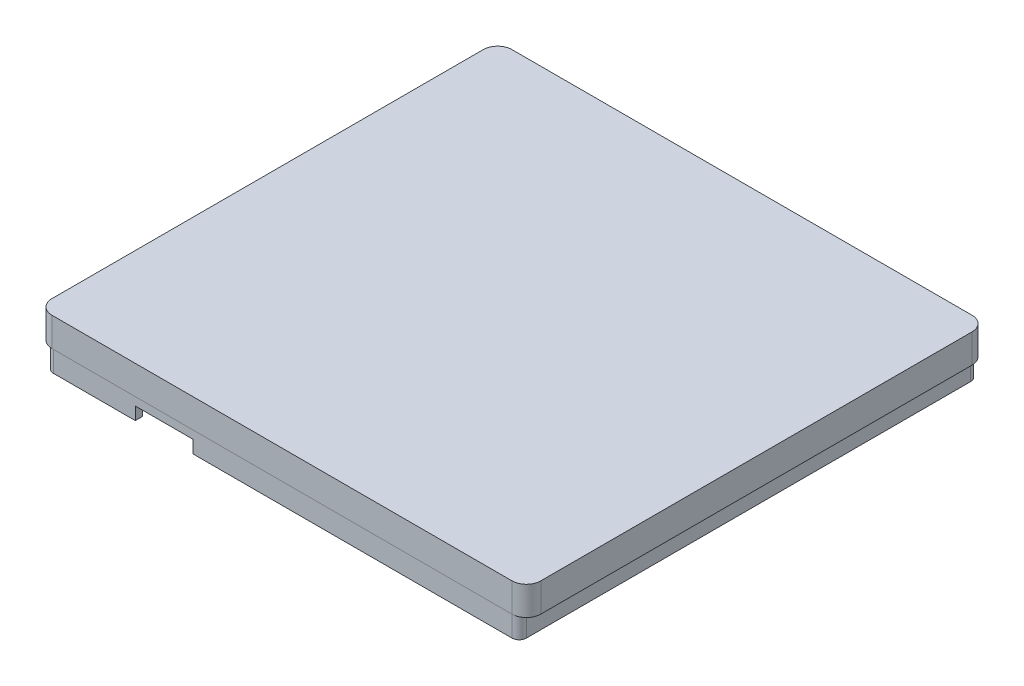
ISO-10303-21;
HEADER;
FILE_DESCRIPTION(('STEP AP214'),'2;1');
FILE_NAME('part.step','',(''),(''),'','','');
FILE_SCHEMA(('AUTOMOTIVE_DESIGN { 1 0 10303 214 1 1 1 1 }'));
ENDSEC;
DATA;
#1=APPLICATION_CONTEXT('core data for automotive mechanical design processes');
#2=APPLICATION_PROTOCOL_DEFINITION('international standard','automotive_design',2000,#1);
#3=PRODUCT_CONTEXT('',#1,'mechanical');
#4=PRODUCT('Part','Part','',(#3));
#5=PRODUCT_RELATED_PRODUCT_CATEGORY('part','',(#4));
#6=PRODUCT_DEFINITION_FORMATION('','',#4);
#7=PRODUCT_DEFINITION_CONTEXT('part definition',#1,'design');
#8=PRODUCT_DEFINITION('design','',#6,#7);
#9=PRODUCT_DEFINITION_SHAPE('','',#8);
#10=(LENGTH_UNIT() NAMED_UNIT(*) SI_UNIT(.MILLI.,.METRE.));
#11=(NAMED_UNIT(*) PLANE_ANGLE_UNIT() SI_UNIT($,.RADIAN.));
#12=(NAMED_UNIT(*) SI_UNIT($,.STERADIAN.) SOLID_ANGLE_UNIT());
#13=UNCERTAINTY_MEASURE_WITH_UNIT(LENGTH_MEASURE(1.E-05),#10,'distance_accuracy_value','');
#14=(GEOMETRIC_REPRESENTATION_CONTEXT(3) GLOBAL_UNCERTAINTY_ASSIGNED_CONTEXT((#13)) GLOBAL_UNIT_ASSIGNED_CONTEXT((#10,
#11,#12)) REPRESENTATION_CONTEXT('',''));
#15=CARTESIAN_POINT('',(0.,0.,0.));
#16=DIRECTION('',(0.,0.,1.));
#17=DIRECTION('',(1.,0.,0.));
#18=AXIS2_PLACEMENT_3D('',#15,#16,#17);
#19=CARTESIAN_POINT('',(-32.,39.0661862772259,30.));
#20=DIRECTION('',(0.,1.,0.));
#21=DIRECTION('',(0.,0.,1.));
#22=AXIS2_PLACEMENT_3D('',#19,#20,#21);
#23=CYLINDRICAL_SURFACE('',#22,2.);
#24=CARTESIAN_POINT('',(-32.,39.0661862772259,30.));
#25=DIRECTION('',(0.,1.,0.));
#26=DIRECTION('',(0.,0.,1.));
#27=AXIS2_PLACEMENT_3D('',#24,#25,#26);
#28=CIRCLE('',#27,2.);
#29=CARTESIAN_POINT('',(-34.,39.0661862772259,30.));
#30=VERTEX_POINT('',#29);
#31=CARTESIAN_POINT('',(-32.,39.0661862772259,32.));
#32=VERTEX_POINT('',#31);
#33=EDGE_CURVE('E443',#30,#32,#28,.T.);
#34=ORIENTED_EDGE('',*,*,#33,.T.);
#35=DIRECTION('',(0.,1.,0.));
#36=VECTOR('',#35,1.);
#37=CARTESIAN_POINT('',(-32.,39.0661862772259,32.));
#38=LINE('',#37,#36);
#39=CARTESIAN_POINT('',(-32.,43.0761862772259,32.));
#40=VERTEX_POINT('',#39);
#41=EDGE_CURVE('E472',#32,#40,#38,.T.);
#42=ORIENTED_EDGE('',*,*,#41,.T.);
#43=CARTESIAN_POINT('',(-32.,43.0761862772259,30.));
#44=DIRECTION('',(0.,1.,0.));
#45=DIRECTION('',(0.,0.,1.));
#46=AXIS2_PLACEMENT_3D('',#43,#44,#45);
#47=CIRCLE('',#46,2.);
#48=CARTESIAN_POINT('',(-32.9,43.0761862772259,31.7860571099492));
#49=VERTEX_POINT('',#48);
#50=EDGE_CURVE('E417',#49,#40,#47,.T.);
#51=ORIENTED_EDGE('',*,*,#50,.F.);
#52=CARTESIAN_POINT('',(-34.,43.0761862772259,30.));
#53=VERTEX_POINT('',#52);
#54=EDGE_CURVE('E418',#53,#49,#47,.T.);
#55=ORIENTED_EDGE('',*,*,#54,.F.);
#56=DIRECTION('',(0.,1.,0.));
#57=VECTOR('',#56,1.);
#58=CARTESIAN_POINT('',(-34.,39.0661862772259,30.));
#59=LINE('',#58,#57);
#60=EDGE_CURVE('E475',#30,#53,#59,.T.);
#61=ORIENTED_EDGE('',*,*,#60,.F.);
#62=EDGE_LOOP('',(#34,#42,#51,#55,#61));
#63=FACE_BOUND('',#62,.T.);
#64=ADVANCED_FACE('F39',(#63),#23,.T.);
#65=CARTESIAN_POINT('',(-32.,39.0661862772259,-30.));
#66=DIRECTION('',(0.,1.,0.));
#67=DIRECTION('',(0.,0.,1.));
#68=AXIS2_PLACEMENT_3D('',#65,#66,#67);
#69=PLANE('',#68);
#70=DIRECTION('',(-1.,0.,0.));
#71=VECTOR('',#70,1.);
#72=CARTESIAN_POINT('',(32.,39.0661862772259,-32.));
#73=LINE('',#72,#71);
#74=CARTESIAN_POINT('',(32.,39.0661862772259,-32.));
#75=VERTEX_POINT('',#74);
#76=CARTESIAN_POINT('',(-32.,39.0661862772259,-32.));
#77=VERTEX_POINT('',#76);
#78=EDGE_CURVE('E455',#75,#77,#73,.T.);
#79=ORIENTED_EDGE('',*,*,#78,.F.);
#80=CARTESIAN_POINT('',(32.,39.0661862772259,-30.));
#81=DIRECTION('',(0.,1.,0.));
#82=DIRECTION('',(0.,0.,1.));
#83=AXIS2_PLACEMENT_3D('',#80,#81,#82);
#84=CIRCLE('',#83,2.);
#85=CARTESIAN_POINT('',(34.,39.0661862772259,-30.));
#86=VERTEX_POINT('',#85);
#87=EDGE_CURVE('E453',#86,#75,#84,.T.);
#88=ORIENTED_EDGE('',*,*,#87,.F.);
#89=DIRECTION('',(0.,0.,-1.));
#90=VECTOR('',#89,1.);
#91=CARTESIAN_POINT('',(34.,39.0661862772259,30.));
#92=LINE('',#91,#90);
#93=CARTESIAN_POINT('',(34.,39.0661862772259,30.));
#94=VERTEX_POINT('',#93);
#95=EDGE_CURVE('E450',#94,#86,#92,.T.);
#96=ORIENTED_EDGE('',*,*,#95,.F.);
#97=CARTESIAN_POINT('',(32.,39.0661862772259,30.));
#98=DIRECTION('',(0.,1.,0.));
#99=DIRECTION('',(0.,0.,1.));
#100=AXIS2_PLACEMENT_3D('',#97,#98,#99);
#101=CIRCLE('',#100,2.);
#102=CARTESIAN_POINT('',(32.,39.0661862772259,32.));
#103=VERTEX_POINT('',#102);
#104=EDGE_CURVE('E448',#103,#94,#101,.T.);
#105=ORIENTED_EDGE('',*,*,#104,.F.);
#106=DIRECTION('',(1.,0.,0.));
#107=VECTOR('',#106,1.);
#108=CARTESIAN_POINT('',(-32.,39.0661862772259,32.));
#109=LINE('',#108,#107);
#110=EDGE_CURVE('E445',#32,#103,#109,.T.);
#111=ORIENTED_EDGE('',*,*,#110,.F.);
#112=ORIENTED_EDGE('',*,*,#33,.F.);
#113=DIRECTION('',(0.,0.,1.));
#114=VECTOR('',#113,1.);
#115=CARTESIAN_POINT('',(-34.,39.0661862772259,-30.));
#116=LINE('',#115,#114);
#117=CARTESIAN_POINT('',(-34.,39.0661862772259,-30.));
#118=VERTEX_POINT('',#117);
#119=EDGE_CURVE('E440',#118,#30,#116,.T.);
#120=ORIENTED_EDGE('',*,*,#119,.F.);
#121=CARTESIAN_POINT('',(-32.,39.0661862772259,-30.));
#122=DIRECTION('',(0.,1.,0.));
#123=DIRECTION('',(0.,0.,1.));
#124=AXIS2_PLACEMENT_3D('',#121,#122,#123);
#125=CIRCLE('',#124,2.);
#126=EDGE_CURVE('E438',#77,#118,#125,.T.);
#127=ORIENTED_EDGE('',*,*,#126,.F.);
#128=EDGE_LOOP('',(#79,#88,#96,#105,#111,#112,#120,#127));
#129=FACE_BOUND('',#128,.T.);
#130=DIRECTION('',(0.,0.,-1.));
#131=VECTOR('',#130,1.);
#132=CARTESIAN_POINT('',(32.9,39.0661862772259,-30.));
#133=LINE('',#132,#131);
#134=CARTESIAN_POINT('',(32.9,39.0661862772259,-30.4358898943541));
#135=VERTEX_POINT('',#134);
#136=CARTESIAN_POINT('',(32.9,39.0661862772259,-30.9));
#137=VERTEX_POINT('',#136);
#138=EDGE_CURVE('E350',#135,#137,#133,.T.);
#139=ORIENTED_EDGE('',*,*,#138,.T.);
#140=CARTESIAN_POINT('',(31.9,39.0661862772259,-30.9));
#141=DIRECTION('',(0.,1.,0.));
#142=DIRECTION('',(0.,0.,1.));
#143=AXIS2_PLACEMENT_3D('',#140,#141,#142);
#144=CIRCLE('',#143,1.);
#145=CARTESIAN_POINT('',(31.9,39.0661862772259,-31.9));
#146=VERTEX_POINT('',#145);
#147=EDGE_CURVE('E77',#137,#146,#144,.T.);
#148=ORIENTED_EDGE('',*,*,#147,.T.);
#149=DIRECTION('',(-1.,0.,0.));
#150=VECTOR('',#149,1.);
#151=CARTESIAN_POINT('',(-32.,39.0661862772259,-31.9));
#152=LINE('',#151,#150);
#153=CARTESIAN_POINT('',(-31.9,39.0661862772259,-31.9));
#154=VERTEX_POINT('',#153);
#155=EDGE_CURVE('E365',#146,#154,#152,.T.);
#156=ORIENTED_EDGE('',*,*,#155,.T.);
#157=CARTESIAN_POINT('',(-31.9,39.0661862772259,-30.9));
#158=DIRECTION('',(0.,1.,0.));
#159=DIRECTION('',(0.,0.,1.));
#160=AXIS2_PLACEMENT_3D('',#157,#158,#159);
#161=CIRCLE('',#160,1.);
#162=CARTESIAN_POINT('',(-32.9,39.0661862772259,-30.9));
#163=VERTEX_POINT('',#162);
#164=EDGE_CURVE('E63',#154,#163,#161,.T.);
#165=ORIENTED_EDGE('',*,*,#164,.T.);
#166=DIRECTION('',(0.,0.,1.));
#167=VECTOR('',#166,1.);
#168=CARTESIAN_POINT('',(-32.9,39.0661862772259,-30.));
#169=LINE('',#168,#167);
#170=CARTESIAN_POINT('',(-32.9,39.0661862772259,-30.435889894354));
#171=VERTEX_POINT('',#170);
#172=EDGE_CURVE('E362',#163,#171,#169,.T.);
#173=ORIENTED_EDGE('',*,*,#172,.T.);
#174=CARTESIAN_POINT('',(-32.,39.0661862772259,-30.));
#175=DIRECTION('',(0.,1.,0.));
#176=DIRECTION('',(0.,0.,1.));
#177=AXIS2_PLACEMENT_3D('',#174,#175,#176);
#178=CIRCLE('',#177,1.);
#179=CARTESIAN_POINT('',(-33.,39.0661862772259,-30.));
#180=VERTEX_POINT('',#179);
#181=EDGE_CURVE('E379',#171,#180,#178,.T.);
#182=ORIENTED_EDGE('',*,*,#181,.T.);
#183=DIRECTION('',(0.,0.,1.));
#184=VECTOR('',#183,1.);
#185=CARTESIAN_POINT('',(-33.,39.0661862772259,-30.));
#186=LINE('',#185,#184);
#187=CARTESIAN_POINT('',(-33.,39.0661862772259,30.));
#188=VERTEX_POINT('',#187);
#189=EDGE_CURVE('E398',#180,#188,#186,.T.);
#190=ORIENTED_EDGE('',*,*,#189,.T.);
#191=CARTESIAN_POINT('',(-32.,39.0661862772259,30.));
#192=DIRECTION('',(0.,1.,0.));
#193=DIRECTION('',(0.,0.,1.));
#194=AXIS2_PLACEMENT_3D('',#191,#192,#193);
#195=CIRCLE('',#194,1.);
#196=CARTESIAN_POINT('',(-32.9,39.0661862772259,30.4358898943541));
#197=VERTEX_POINT('',#196);
#198=EDGE_CURVE('E406',#188,#197,#195,.T.);
#199=ORIENTED_EDGE('',*,*,#198,.T.);
#200=CARTESIAN_POINT('',(-32.9,39.0661862772259,30.9));
#201=VERTEX_POINT('',#200);
#202=EDGE_CURVE('E360',#197,#201,#169,.T.);
#203=ORIENTED_EDGE('',*,*,#202,.T.);
#204=CARTESIAN_POINT('',(-31.9,39.0661862772259,30.9));
#205=DIRECTION('',(0.,1.,0.));
#206=DIRECTION('',(0.,0.,1.));
#207=AXIS2_PLACEMENT_3D('',#204,#205,#206);
#208=CIRCLE('',#207,1.);
#209=CARTESIAN_POINT('',(-31.9,39.0661862772259,31.9));
#210=VERTEX_POINT('',#209);
#211=EDGE_CURVE('E126',#201,#210,#208,.T.);
#212=ORIENTED_EDGE('',*,*,#211,.T.);
#213=DIRECTION('',(1.,0.,0.));
#214=VECTOR('',#213,1.);
#215=CARTESIAN_POINT('',(-32.,39.0661862772259,31.9));
#216=LINE('',#215,#214);
#217=CARTESIAN_POINT('',(31.9,39.0661862772259,31.9));
#218=VERTEX_POINT('',#217);
#219=EDGE_CURVE('E363',#210,#218,#216,.T.);
#220=ORIENTED_EDGE('',*,*,#219,.T.);
#221=CARTESIAN_POINT('',(31.9,39.0661862772259,30.9));
#222=DIRECTION('',(0.,1.,0.));
#223=DIRECTION('',(0.,0.,1.));
#224=AXIS2_PLACEMENT_3D('',#221,#222,#223);
#225=CIRCLE('',#224,1.);
#226=CARTESIAN_POINT('',(32.9,39.0661862772259,30.9));
#227=VERTEX_POINT('',#226);
#228=EDGE_CURVE('E119',#218,#227,#225,.T.);
#229=ORIENTED_EDGE('',*,*,#228,.T.);
#230=CARTESIAN_POINT('',(32.9,39.0661862772259,30.4358898943541));
#231=VERTEX_POINT('',#230);
#232=EDGE_CURVE('E353',#227,#231,#133,.T.);
#233=ORIENTED_EDGE('',*,*,#232,.T.);
#234=CARTESIAN_POINT('',(32.,39.0661862772259,30.));
#235=DIRECTION('',(0.,1.,0.));
#236=DIRECTION('',(0.,0.,1.));
#237=AXIS2_PLACEMENT_3D('',#234,#235,#236);
#238=CIRCLE('',#237,1.);
#239=CARTESIAN_POINT('',(33.,39.0661862772259,30.));
#240=VERTEX_POINT('',#239);
#241=EDGE_CURVE('E404',#231,#240,#238,.T.);
#242=ORIENTED_EDGE('',*,*,#241,.T.);
#243=DIRECTION('',(0.,0.,-1.));
#244=VECTOR('',#243,1.);
#245=CARTESIAN_POINT('',(33.,39.0661862772259,-30.));
#246=LINE('',#245,#244);
#247=CARTESIAN_POINT('',(33.,39.0661862772259,-30.));
#248=VERTEX_POINT('',#247);
#249=EDGE_CURVE('E401',#240,#248,#246,.T.);
#250=ORIENTED_EDGE('',*,*,#249,.T.);
#251=CARTESIAN_POINT('',(32.,39.0661862772259,-30.));
#252=DIRECTION('',(0.,1.,0.));
#253=DIRECTION('',(0.,0.,1.));
#254=AXIS2_PLACEMENT_3D('',#251,#252,#253);
#255=CIRCLE('',#254,1.);
#256=EDGE_CURVE('E373',#248,#135,#255,.T.);
#257=ORIENTED_EDGE('',*,*,#256,.T.);
#258=EDGE_LOOP('',(#139,#148,#156,#165,#173,#182,#190,#199,#203,#212,#220,#229,#233,#242,#250,#257));
#259=FACE_BOUND('',#258,.T.);
#260=ADVANCED_FACE('F575',(#129,#259),#69,.F.);
#261=CARTESIAN_POINT('',(-32.,42.0761862772259,-30.));
#262=DIRECTION('',(0.,1.,0.));
#263=DIRECTION('',(0.,0.,1.));
#264=AXIS2_PLACEMENT_3D('',#261,#262,#263);
#265=PLANE('',#264);
#266=CARTESIAN_POINT('',(-32.,42.0761862772259,-30.));
#267=DIRECTION('',(0.,1.,0.));
#268=DIRECTION('',(0.,0.,1.));
#269=AXIS2_PLACEMENT_3D('',#266,#267,#268);
#270=CIRCLE('',#269,1.);
#271=CARTESIAN_POINT('',(-32.9,42.0761862772259,-30.435889894354));
#272=VERTEX_POINT('',#271);
#273=CARTESIAN_POINT('',(-33.,42.0761862772259,-30.));
#274=VERTEX_POINT('',#273);
#275=EDGE_CURVE('E368',#272,#274,#270,.T.);
#276=ORIENTED_EDGE('',*,*,#275,.F.);
#277=DIRECTION('',(0.,0.,1.));
#278=VECTOR('',#277,1.);
#279=CARTESIAN_POINT('',(-32.9,42.0761862772259,-30.));
#280=LINE('',#279,#278);
#281=CARTESIAN_POINT('',(-32.9,42.0761862772259,30.4358898943541));
#282=VERTEX_POINT('',#281);
#283=EDGE_CURVE('E493',#272,#282,#280,.T.);
#284=ORIENTED_EDGE('',*,*,#283,.T.);
#285=CARTESIAN_POINT('',(-32.,42.0761862772259,30.));
#286=DIRECTION('',(0.,1.,0.));
#287=DIRECTION('',(0.,0.,1.));
#288=AXIS2_PLACEMENT_3D('',#285,#286,#287);
#289=CIRCLE('',#288,1.);
#290=CARTESIAN_POINT('',(-33.,42.0761862772259,30.));
#291=VERTEX_POINT('',#290);
#292=EDGE_CURVE('E391',#291,#282,#289,.T.);
#293=ORIENTED_EDGE('',*,*,#292,.F.);
#294=DIRECTION('',(0.,0.,1.));
#295=VECTOR('',#294,1.);
#296=CARTESIAN_POINT('',(-33.,42.0761862772259,-30.));
#297=LINE('',#296,#295);
#298=EDGE_CURVE('E375',#274,#291,#297,.T.);
#299=ORIENTED_EDGE('',*,*,#298,.F.);
#300=EDGE_LOOP('',(#276,#284,#293,#299));
#301=FACE_BOUND('',#300,.T.);
#302=ADVANCED_FACE('F582',(#301),#265,.F.);
#303=CARTESIAN_POINT('',(-32.,39.0661862772259,-30.));
#304=DIRECTION('',(0.,1.,0.));
#305=DIRECTION('',(0.,0.,1.));
#306=AXIS2_PLACEMENT_3D('',#303,#304,#305);
#307=CYLINDRICAL_SURFACE('',#306,2.);
#308=ORIENTED_EDGE('',*,*,#126,.T.);
#309=DIRECTION('',(0.,1.,0.));
#310=VECTOR('',#309,1.);
#311=CARTESIAN_POINT('',(-34.,39.0661862772259,-30.));
#312=LINE('',#311,#310);
#313=CARTESIAN_POINT('',(-34.,43.0761862772259,-30.));
#314=VERTEX_POINT('',#313);
#315=EDGE_CURVE('E458',#118,#314,#312,.T.);
#316=ORIENTED_EDGE('',*,*,#315,.T.);
#317=CARTESIAN_POINT('',(-32.,43.0761862772259,-30.));
#318=DIRECTION('',(0.,1.,0.));
#319=DIRECTION('',(0.,0.,1.));
#320=AXIS2_PLACEMENT_3D('',#317,#318,#319);
#321=CIRCLE('',#320,2.);
#322=CARTESIAN_POINT('',(-32.6244997998398,43.0761862772259,-31.9));
#323=VERTEX_POINT('',#322);
#324=EDGE_CURVE('E383',#323,#314,#321,.T.);
#325=ORIENTED_EDGE('',*,*,#324,.F.);
#326=CARTESIAN_POINT('',(-32.,43.0761862772259,-32.));
#327=VERTEX_POINT('',#326);
#328=EDGE_CURVE('E411',#327,#323,#321,.T.);
#329=ORIENTED_EDGE('',*,*,#328,.F.);
#330=DIRECTION('',(0.,1.,0.));
#331=VECTOR('',#330,1.);
#332=CARTESIAN_POINT('',(-32.,39.0661862772259,-32.));
#333=LINE('',#332,#331);
#334=EDGE_CURVE('E459',#77,#327,#333,.T.);
#335=ORIENTED_EDGE('',*,*,#334,.F.);
#336=EDGE_LOOP('',(#308,#316,#325,#329,#335));
#337=FACE_BOUND('',#336,.T.);
#338=ADVANCED_FACE('F594',(#337),#307,.T.);
#339=CARTESIAN_POINT('',(32.,39.0661862772259,-32.));
#340=DIRECTION('',(0.,0.,-1.));
#341=DIRECTION('',(-1.,0.,0.));
#342=AXIS2_PLACEMENT_3D('',#339,#340,#341);
#343=PLANE('',#342);
#344=ORIENTED_EDGE('',*,*,#334,.T.);
#345=DIRECTION('',(-1.,0.,0.));
#346=VECTOR('',#345,1.);
#347=CARTESIAN_POINT('',(32.,43.0761862772259,-32.));
#348=LINE('',#347,#346);
#349=CARTESIAN_POINT('',(32.,43.0761862772259,-32.));
#350=VERTEX_POINT('',#349);
#351=EDGE_CURVE('E435',#350,#327,#348,.T.);
#352=ORIENTED_EDGE('',*,*,#351,.F.);
#353=DIRECTION('',(0.,1.,0.));
#354=VECTOR('',#353,1.);
#355=CARTESIAN_POINT('',(32.,39.0661862772259,-32.));
#356=LINE('',#355,#354);
#357=EDGE_CURVE('E462',#75,#350,#356,.T.);
#358=ORIENTED_EDGE('',*,*,#357,.F.);
#359=ORIENTED_EDGE('',*,*,#78,.T.);
#360=EDGE_LOOP('',(#344,#352,#358,#359));
#361=FACE_BOUND('',#360,.T.);
#362=ADVANCED_FACE('F597',(#361),#343,.T.);
#363=CARTESIAN_POINT('',(32.,39.0661862772259,-30.));
#364=DIRECTION('',(0.,1.,0.));
#365=DIRECTION('',(0.,0.,1.));
#366=AXIS2_PLACEMENT_3D('',#363,#364,#365);
#367=CYLINDRICAL_SURFACE('',#366,2.);
#368=ORIENTED_EDGE('',*,*,#87,.T.);
#369=ORIENTED_EDGE('',*,*,#357,.T.);
#370=CARTESIAN_POINT('',(32.,43.0761862772259,-30.));
#371=DIRECTION('',(0.,1.,0.));
#372=DIRECTION('',(0.,0.,1.));
#373=AXIS2_PLACEMENT_3D('',#370,#371,#372);
#374=CIRCLE('',#373,2.);
#375=CARTESIAN_POINT('',(32.9,43.0761862772259,-31.7860571099492));
#376=VERTEX_POINT('',#375);
#377=EDGE_CURVE('E431',#376,#350,#374,.T.);
#378=ORIENTED_EDGE('',*,*,#377,.F.);
#379=CARTESIAN_POINT('',(34.,43.0761862772259,-30.));
#380=VERTEX_POINT('',#379);
#381=EDGE_CURVE('E432',#380,#376,#374,.T.);
#382=ORIENTED_EDGE('',*,*,#381,.F.);
#383=DIRECTION('',(0.,1.,0.));
#384=VECTOR('',#383,1.);
#385=CARTESIAN_POINT('',(34.,39.0661862772259,-30.));
#386=LINE('',#385,#384);
#387=EDGE_CURVE('E465',#86,#380,#386,.T.);
#388=ORIENTED_EDGE('',*,*,#387,.F.);
#389=EDGE_LOOP('',(#368,#369,#378,#382,#388));
#390=FACE_BOUND('',#389,.T.);
#391=ADVANCED_FACE('F667',(#390),#367,.T.);
#392=CARTESIAN_POINT('',(34.,39.0661862772259,30.));
#393=DIRECTION('',(1.,0.,0.));
#394=DIRECTION('',(0.,0.,-1.));
#395=AXIS2_PLACEMENT_3D('',#392,#393,#394);
#396=PLANE('',#395);
#397=ORIENTED_EDGE('',*,*,#387,.T.);
#398=DIRECTION('',(0.,0.,-1.));
#399=VECTOR('',#398,1.);
#400=CARTESIAN_POINT('',(34.,43.0761862772259,30.));
#401=LINE('',#400,#399);
#402=CARTESIAN_POINT('',(34.,43.0761862772259,30.));
#403=VERTEX_POINT('',#402);
#404=EDGE_CURVE('E428',#403,#380,#401,.T.);
#405=ORIENTED_EDGE('',*,*,#404,.F.);
#406=DIRECTION('',(0.,1.,0.));
#407=VECTOR('',#406,1.);
#408=CARTESIAN_POINT('',(34.,39.0661862772259,30.));
#409=LINE('',#408,#407);
#410=EDGE_CURVE('E467',#94,#403,#409,.T.);
#411=ORIENTED_EDGE('',*,*,#410,.F.);
#412=ORIENTED_EDGE('',*,*,#95,.T.);
#413=EDGE_LOOP('',(#397,#405,#411,#412));
#414=FACE_BOUND('',#413,.T.);
#415=ADVANCED_FACE('F671',(#414),#396,.T.);
#416=CARTESIAN_POINT('',(32.,39.0661862772259,30.));
#417=DIRECTION('',(0.,1.,0.));
#418=DIRECTION('',(0.,0.,1.));
#419=AXIS2_PLACEMENT_3D('',#416,#417,#418);
#420=CYLINDRICAL_SURFACE('',#419,2.);
#421=ORIENTED_EDGE('',*,*,#104,.T.);
#422=ORIENTED_EDGE('',*,*,#410,.T.);
#423=CARTESIAN_POINT('',(32.,43.0761862772259,30.));
#424=DIRECTION('',(0.,1.,0.));
#425=DIRECTION('',(0.,0.,1.));
#426=AXIS2_PLACEMENT_3D('',#423,#424,#425);
#427=CIRCLE('',#426,2.);
#428=CARTESIAN_POINT('',(32.6244997998399,43.0761862772259,31.9));
#429=VERTEX_POINT('',#428);
#430=EDGE_CURVE('E424',#429,#403,#427,.T.);
#431=ORIENTED_EDGE('',*,*,#430,.F.);
#432=CARTESIAN_POINT('',(32.,43.0761862772259,32.));
#433=VERTEX_POINT('',#432);
#434=EDGE_CURVE('E425',#433,#429,#427,.T.);
#435=ORIENTED_EDGE('',*,*,#434,.F.);
#436=DIRECTION('',(0.,1.,0.));
#437=VECTOR('',#436,1.);
#438=CARTESIAN_POINT('',(32.,39.0661862772259,32.));
#439=LINE('',#438,#437);
#440=EDGE_CURVE('E470',#103,#433,#439,.T.);
#441=ORIENTED_EDGE('',*,*,#440,.F.);
#442=EDGE_LOOP('',(#421,#422,#431,#435,#441));
#443=FACE_BOUND('',#442,.T.);
#444=ADVANCED_FACE('F674',(#443),#420,.T.);
#445=CARTESIAN_POINT('',(-32.,39.0661862772259,32.));
#446=DIRECTION('',(0.,0.,1.));
#447=DIRECTION('',(1.,0.,0.));
#448=AXIS2_PLACEMENT_3D('',#445,#446,#447);
#449=PLANE('',#448);
#450=ORIENTED_EDGE('',*,*,#440,.T.);
#451=DIRECTION('',(1.,0.,0.));
#452=VECTOR('',#451,1.);
#453=CARTESIAN_POINT('',(-32.,43.0761862772259,32.));
#454=LINE('',#453,#452);
#455=EDGE_CURVE('E421',#40,#433,#454,.T.);
#456=ORIENTED_EDGE('',*,*,#455,.F.);
#457=ORIENTED_EDGE('',*,*,#41,.F.);
#458=ORIENTED_EDGE('',*,*,#110,.T.);
#459=EDGE_LOOP('',(#450,#456,#457,#458));
#460=FACE_BOUND('',#459,.T.);
#461=ADVANCED_FACE('F587',(#460),#449,.T.);
#462=CARTESIAN_POINT('',(-34.,39.0661862772259,-30.));
#463=DIRECTION('',(-1.,0.,0.));
#464=DIRECTION('',(0.,0.,1.));
#465=AXIS2_PLACEMENT_3D('',#462,#463,#464);
#466=PLANE('',#465);
#467=ORIENTED_EDGE('',*,*,#60,.T.);
#468=DIRECTION('',(0.,0.,1.));
#469=VECTOR('',#468,1.);
#470=CARTESIAN_POINT('',(-34.,43.0761862772259,-30.));
#471=LINE('',#470,#469);
#472=EDGE_CURVE('E414',#314,#53,#471,.T.);
#473=ORIENTED_EDGE('',*,*,#472,.F.);
#474=ORIENTED_EDGE('',*,*,#315,.F.);
#475=ORIENTED_EDGE('',*,*,#119,.T.);
#476=EDGE_LOOP('',(#467,#473,#474,#475));
#477=FACE_BOUND('',#476,.T.);
#478=ADVANCED_FACE('F589',(#477),#466,.T.);
#479=CARTESIAN_POINT('',(-32.,43.0761862772259,-30.));
#480=DIRECTION('',(0.,1.,0.));
#481=DIRECTION('',(0.,0.,1.));
#482=AXIS2_PLACEMENT_3D('',#479,#480,#481);
#483=PLANE('',#482);
#484=ORIENTED_EDGE('',*,*,#434,.T.);
#485=ORIENTED_EDGE('',*,*,#430,.T.);
#486=ORIENTED_EDGE('',*,*,#404,.T.);
#487=ORIENTED_EDGE('',*,*,#381,.T.);
#488=ORIENTED_EDGE('',*,*,#377,.T.);
#489=ORIENTED_EDGE('',*,*,#351,.T.);
#490=ORIENTED_EDGE('',*,*,#328,.T.);
#491=ORIENTED_EDGE('',*,*,#324,.T.);
#492=ORIENTED_EDGE('',*,*,#472,.T.);
#493=ORIENTED_EDGE('',*,*,#54,.T.);
#494=ORIENTED_EDGE('',*,*,#50,.T.);
#495=ORIENTED_EDGE('',*,*,#455,.T.);
#496=EDGE_LOOP('',(#484,#485,#486,#487,#488,#489,#490,#491,#492,#493,#494,#495));
#497=FACE_BOUND('',#496,.T.);
#498=ADVANCED_FACE('F592',(#497),#483,.T.);
#499=CARTESIAN_POINT('',(-32.,39.0661862772259,-30.));
#500=DIRECTION('',(0.,1.,0.));
#501=DIRECTION('',(0.,0.,1.));
#502=AXIS2_PLACEMENT_3D('',#499,#500,#501);
#503=CYLINDRICAL_SURFACE('',#502,1.);
#504=ORIENTED_EDGE('',*,*,#181,.F.);
#505=DIRECTION('',(0.,1.,0.));
#506=VECTOR('',#505,1.);
#507=CARTESIAN_POINT('',(-32.9,39.0661862772259,-30.435889894354));
#508=LINE('',#507,#506);
#509=EDGE_CURVE('E357',#171,#272,#508,.T.);
#510=ORIENTED_EDGE('',*,*,#509,.T.);
#511=ORIENTED_EDGE('',*,*,#275,.T.);
#512=DIRECTION('',(0.,1.,0.));
#513=VECTOR('',#512,1.);
#514=CARTESIAN_POINT('',(-33.,39.0661862772259,-30.));
#515=LINE('',#514,#513);
#516=EDGE_CURVE('E369',#180,#274,#515,.T.);
#517=ORIENTED_EDGE('',*,*,#516,.F.);
#518=EDGE_LOOP('',(#504,#510,#511,#517));
#519=FACE_BOUND('',#518,.T.);
#520=ADVANCED_FACE('F635',(#519),#503,.F.);
#521=CARTESIAN_POINT('',(32.,39.0661862772259,-30.));
#522=DIRECTION('',(0.,1.,0.));
#523=DIRECTION('',(0.,0.,1.));
#524=AXIS2_PLACEMENT_3D('',#521,#522,#523);
#525=CYLINDRICAL_SURFACE('',#524,1.);
#526=CARTESIAN_POINT('',(32.,42.0761862772259,-30.));
#527=DIRECTION('',(0.,1.,0.));
#528=DIRECTION('',(0.,0.,1.));
#529=AXIS2_PLACEMENT_3D('',#526,#527,#528);
#530=CIRCLE('',#529,1.);
#531=CARTESIAN_POINT('',(33.,42.0761862772259,-30.));
#532=VERTEX_POINT('',#531);
#533=CARTESIAN_POINT('',(32.9,42.0761862772259,-30.4358898943541));
#534=VERTEX_POINT('',#533);
#535=EDGE_CURVE('E376',#532,#534,#530,.T.);
#536=ORIENTED_EDGE('',*,*,#535,.T.);
#537=DIRECTION('',(0.,1.,0.));
#538=VECTOR('',#537,1.);
#539=CARTESIAN_POINT('',(32.9,39.0661862772259,-30.4358898943541));
#540=LINE('',#539,#538);
#541=EDGE_CURVE('E347',#534,#135,#540,.F.);
#542=ORIENTED_EDGE('',*,*,#541,.T.);
#543=ORIENTED_EDGE('',*,*,#256,.F.);
#544=DIRECTION('',(0.,1.,0.));
#545=VECTOR('',#544,1.);
#546=CARTESIAN_POINT('',(33.,39.0661862772259,-30.));
#547=LINE('',#546,#545);
#548=EDGE_CURVE('E381',#248,#532,#547,.T.);
#549=ORIENTED_EDGE('',*,*,#548,.T.);
#550=EDGE_LOOP('',(#536,#542,#543,#549));
#551=FACE_BOUND('',#550,.T.);
#552=ADVANCED_FACE('F638',(#551),#525,.F.);
#553=CARTESIAN_POINT('',(33.,39.0661862772259,30.));
#554=DIRECTION('',(1.,0.,0.));
#555=DIRECTION('',(0.,0.,-1.));
#556=AXIS2_PLACEMENT_3D('',#553,#554,#555);
#557=PLANE('',#556);
#558=ORIENTED_EDGE('',*,*,#548,.F.);
#559=ORIENTED_EDGE('',*,*,#249,.F.);
#560=DIRECTION('',(0.,1.,0.));
#561=VECTOR('',#560,1.);
#562=CARTESIAN_POINT('',(33.,39.0661862772259,30.));
#563=LINE('',#562,#561);
#564=CARTESIAN_POINT('',(33.,42.0761862772259,30.));
#565=VERTEX_POINT('',#564);
#566=EDGE_CURVE('E384',#240,#565,#563,.T.);
#567=ORIENTED_EDGE('',*,*,#566,.T.);
#568=DIRECTION('',(0.,0.,-1.));
#569=VECTOR('',#568,1.);
#570=CARTESIAN_POINT('',(33.,42.0761862772259,-30.));
#571=LINE('',#570,#569);
#572=EDGE_CURVE('E380',#565,#532,#571,.T.);
#573=ORIENTED_EDGE('',*,*,#572,.T.);
#574=EDGE_LOOP('',(#558,#559,#567,#573));
#575=FACE_BOUND('',#574,.T.);
#576=ADVANCED_FACE('F642',(#575),#557,.F.);
#577=CARTESIAN_POINT('',(32.,39.0661862772259,30.));
#578=DIRECTION('',(0.,1.,0.));
#579=DIRECTION('',(0.,0.,1.));
#580=AXIS2_PLACEMENT_3D('',#577,#578,#579);
#581=CYLINDRICAL_SURFACE('',#580,1.);
#582=ORIENTED_EDGE('',*,*,#241,.F.);
#583=DIRECTION('',(0.,1.,0.));
#584=VECTOR('',#583,1.);
#585=CARTESIAN_POINT('',(32.9,39.0661862772259,30.4358898943541));
#586=LINE('',#585,#584);
#587=CARTESIAN_POINT('',(32.9,42.0761862772259,30.4358898943541));
#588=VERTEX_POINT('',#587);
#589=EDGE_CURVE('E344',#231,#588,#586,.T.);
#590=ORIENTED_EDGE('',*,*,#589,.T.);
#591=CARTESIAN_POINT('',(32.,42.0761862772259,30.));
#592=DIRECTION('',(0.,1.,0.));
#593=DIRECTION('',(0.,0.,1.));
#594=AXIS2_PLACEMENT_3D('',#591,#592,#593);
#595=CIRCLE('',#594,1.);
#596=EDGE_CURVE('E387',#588,#565,#595,.T.);
#597=ORIENTED_EDGE('',*,*,#596,.T.);
#598=ORIENTED_EDGE('',*,*,#566,.F.);
#599=EDGE_LOOP('',(#582,#590,#597,#598));
#600=FACE_BOUND('',#599,.T.);
#601=ADVANCED_FACE('F646',(#600),#581,.F.);
#602=CARTESIAN_POINT('',(-32.,39.0661862772259,30.));
#603=DIRECTION('',(0.,1.,0.));
#604=DIRECTION('',(0.,0.,1.));
#605=AXIS2_PLACEMENT_3D('',#602,#603,#604);
#606=CYLINDRICAL_SURFACE('',#605,1.);
#607=ORIENTED_EDGE('',*,*,#292,.T.);
#608=DIRECTION('',(0.,1.,0.));
#609=VECTOR('',#608,1.);
#610=CARTESIAN_POINT('',(-32.9,39.0661862772259,30.4358898943541));
#611=LINE('',#610,#609);
#612=EDGE_CURVE('E354',#282,#197,#611,.F.);
#613=ORIENTED_EDGE('',*,*,#612,.T.);
#614=ORIENTED_EDGE('',*,*,#198,.F.);
#615=DIRECTION('',(0.,1.,0.));
#616=VECTOR('',#615,1.);
#617=CARTESIAN_POINT('',(-33.,39.0661862772259,30.));
#618=LINE('',#617,#616);
#619=EDGE_CURVE('E372',#188,#291,#618,.T.);
#620=ORIENTED_EDGE('',*,*,#619,.T.);
#621=EDGE_LOOP('',(#607,#613,#614,#620));
#622=FACE_BOUND('',#621,.T.);
#623=ADVANCED_FACE('F650',(#622),#606,.F.);
#624=CARTESIAN_POINT('',(-33.,39.0661862772259,-30.));
#625=DIRECTION('',(-1.,0.,0.));
#626=DIRECTION('',(0.,0.,1.));
#627=AXIS2_PLACEMENT_3D('',#624,#625,#626);
#628=PLANE('',#627);
#629=ORIENTED_EDGE('',*,*,#619,.F.);
#630=ORIENTED_EDGE('',*,*,#189,.F.);
#631=ORIENTED_EDGE('',*,*,#516,.T.);
#632=ORIENTED_EDGE('',*,*,#298,.T.);
#633=EDGE_LOOP('',(#629,#630,#631,#632));
#634=FACE_BOUND('',#633,.T.);
#635=ADVANCED_FACE('F654',(#634),#628,.F.);
#636=ORIENTED_EDGE('',*,*,#596,.F.);
#637=DIRECTION('',(0.,0.,-1.));
#638=VECTOR('',#637,1.);
#639=CARTESIAN_POINT('',(32.9,42.0761862772259,-30.));
#640=LINE('',#639,#638);
#641=EDGE_CURVE('E490',#588,#534,#640,.T.);
#642=ORIENTED_EDGE('',*,*,#641,.T.);
#643=ORIENTED_EDGE('',*,*,#535,.F.);
#644=ORIENTED_EDGE('',*,*,#572,.F.);
#645=EDGE_LOOP('',(#636,#642,#643,#644));
#646=FACE_BOUND('',#645,.T.);
#647=ADVANCED_FACE('F624',(#646),#265,.F.);
#648=CARTESIAN_POINT('',(-31.9,36.0761862772259,0.));
#649=DIRECTION('',(-1.,0.,0.));
#650=DIRECTION('',(0.,0.,1.));
#651=AXIS2_PLACEMENT_3D('',#648,#649,#650);
#652=PLANE('',#651);
#653=DIRECTION('',(0.,1.,0.));
#654=VECTOR('',#653,1.);
#655=CARTESIAN_POINT('',(-31.9,36.0761862772259,-30.9));
#656=LINE('',#655,#654);
#657=CARTESIAN_POINT('',(-31.9,36.0761862772259,-30.9));
#658=VERTEX_POINT('',#657);
#659=CARTESIAN_POINT('',(-31.9,42.0761862772259,-30.9));
#660=VERTEX_POINT('',#659);
#661=EDGE_CURVE('E322',#658,#660,#656,.T.);
#662=ORIENTED_EDGE('',*,*,#661,.T.);
#663=DIRECTION('',(0.,0.,1.));
#664=VECTOR('',#663,1.);
#665=CARTESIAN_POINT('',(-31.9,42.0761862772259,-30.));
#666=LINE('',#665,#664);
#667=CARTESIAN_POINT('',(-31.9,42.0761862772259,30.9));
#668=VERTEX_POINT('',#667);
#669=EDGE_CURVE('E487',#660,#668,#666,.T.);
#670=ORIENTED_EDGE('',*,*,#669,.T.);
#671=DIRECTION('',(0.,1.,0.));
#672=VECTOR('',#671,1.);
#673=CARTESIAN_POINT('',(-31.9,36.0761862772259,30.9));
#674=LINE('',#673,#672);
#675=CARTESIAN_POINT('',(-31.9,36.0761862772259,30.9));
#676=VERTEX_POINT('',#675);
#677=EDGE_CURVE('E321',#676,#668,#674,.T.);
#678=ORIENTED_EDGE('',*,*,#677,.F.);
#679=DIRECTION('',(0.,0.,1.));
#680=VECTOR('',#679,1.);
#681=CARTESIAN_POINT('',(-31.9,36.0761862772259,0.));
#682=LINE('',#681,#680);
#683=EDGE_CURVE('E308',#658,#676,#682,.T.);
#684=ORIENTED_EDGE('',*,*,#683,.F.);
#685=EDGE_LOOP('',(#662,#670,#678,#684));
#686=FACE_BOUND('',#685,.T.);
#687=ADVANCED_FACE('F564',(#686),#652,.F.);
#688=CARTESIAN_POINT('',(0.,36.0761862772259,-30.9));
#689=DIRECTION('',(0.,0.,-1.));
#690=DIRECTION('',(-1.,0.,0.));
#691=AXIS2_PLACEMENT_3D('',#688,#689,#690);
#692=PLANE('',#691);
#693=DIRECTION('',(0.,1.,0.));
#694=VECTOR('',#693,1.);
#695=CARTESIAN_POINT('',(31.9,36.0761862772259,-30.9));
#696=LINE('',#695,#694);
#697=CARTESIAN_POINT('',(31.9,36.0761862772259,-30.9));
#698=VERTEX_POINT('',#697);
#699=CARTESIAN_POINT('',(31.9,42.0761862772259,-30.9));
#700=VERTEX_POINT('',#699);
#701=EDGE_CURVE('E326',#698,#700,#696,.T.);
#702=ORIENTED_EDGE('',*,*,#701,.T.);
#703=DIRECTION('',(-1.,0.,0.));
#704=VECTOR('',#703,1.);
#705=CARTESIAN_POINT('',(-32.,42.0761862772259,-30.9));
#706=LINE('',#705,#704);
#707=EDGE_CURVE('E484',#700,#660,#706,.T.);
#708=ORIENTED_EDGE('',*,*,#707,.T.);
#709=ORIENTED_EDGE('',*,*,#661,.F.);
#710=DIRECTION('',(-1.,0.,0.));
#711=VECTOR('',#710,1.);
#712=CARTESIAN_POINT('',(0.,36.0761862772259,-30.9));
#713=LINE('',#712,#711);
#714=EDGE_CURVE('E318',#698,#658,#713,.T.);
#715=ORIENTED_EDGE('',*,*,#714,.F.);
#716=EDGE_LOOP('',(#702,#708,#709,#715));
#717=FACE_BOUND('',#716,.T.);
#718=ADVANCED_FACE('F562',(#717),#692,.F.);
#719=CARTESIAN_POINT('',(31.9,36.0761862772259,0.));
#720=DIRECTION('',(1.,0.,0.));
#721=DIRECTION('',(0.,0.,-1.));
#722=AXIS2_PLACEMENT_3D('',#719,#720,#721);
#723=PLANE('',#722);
#724=DIRECTION('',(0.,1.,0.));
#725=VECTOR('',#724,1.);
#726=CARTESIAN_POINT('',(31.9,36.0761862772259,30.9));
#727=LINE('',#726,#725);
#728=CARTESIAN_POINT('',(31.9,36.0761862772259,30.9));
#729=VERTEX_POINT('',#728);
#730=CARTESIAN_POINT('',(31.9,42.0761862772259,30.9));
#731=VERTEX_POINT('',#730);
#732=EDGE_CURVE('E329',#729,#731,#727,.T.);
#733=ORIENTED_EDGE('',*,*,#732,.T.);
#734=DIRECTION('',(0.,0.,-1.));
#735=VECTOR('',#734,1.);
#736=CARTESIAN_POINT('',(31.9,42.0761862772259,-30.));
#737=LINE('',#736,#735);
#738=EDGE_CURVE('E481',#731,#700,#737,.T.);
#739=ORIENTED_EDGE('',*,*,#738,.T.);
#740=ORIENTED_EDGE('',*,*,#701,.F.);
#741=DIRECTION('',(0.,0.,-1.));
#742=VECTOR('',#741,1.);
#743=CARTESIAN_POINT('',(31.9,36.0761862772259,0.));
#744=LINE('',#743,#742);
#745=EDGE_CURVE('E315',#729,#698,#744,.T.);
#746=ORIENTED_EDGE('',*,*,#745,.F.);
#747=EDGE_LOOP('',(#733,#739,#740,#746));
#748=FACE_BOUND('',#747,.T.);
#749=ADVANCED_FACE('F558',(#748),#723,.F.);
#750=CARTESIAN_POINT('',(0.,36.0761862772259,30.9));
#751=DIRECTION('',(0.,0.,1.));
#752=DIRECTION('',(1.,0.,0.));
#753=AXIS2_PLACEMENT_3D('',#750,#751,#752);
#754=PLANE('',#753);
#755=DIRECTION('',(1.,0.,0.));
#756=VECTOR('',#755,1.);
#757=CARTESIAN_POINT('',(0.,36.0761862772259,30.9));
#758=LINE('',#757,#756);
#759=CARTESIAN_POINT('',(-12.5,36.0761862772259,30.9));
#760=VERTEX_POINT('',#759);
#761=EDGE_CURVE('E311',#760,#729,#758,.T.);
#762=ORIENTED_EDGE('',*,*,#761,.F.);
#763=DIRECTION('',(0.,1.,0.));
#764=VECTOR('',#763,1.);
#765=CARTESIAN_POINT('',(-12.5,36.0761862772259,30.9));
#766=LINE('',#765,#764);
#767=CARTESIAN_POINT('',(-12.5,37.8409539954935,30.9));
#768=VERTEX_POINT('',#767);
#769=EDGE_CURVE('E305',#760,#768,#766,.T.);
#770=ORIENTED_EDGE('',*,*,#769,.T.);
#771=DIRECTION('',(-1.,0.,0.));
#772=VECTOR('',#771,1.);
#773=CARTESIAN_POINT('',(0.,37.8409539954935,30.9));
#774=LINE('',#773,#772);
#775=CARTESIAN_POINT('',(-20.5,37.8409539954935,30.9));
#776=VERTEX_POINT('',#775);
#777=EDGE_CURVE('E288',#768,#776,#774,.T.);
#778=ORIENTED_EDGE('',*,*,#777,.T.);
#779=DIRECTION('',(0.,-1.,0.));
#780=VECTOR('',#779,1.);
#781=CARTESIAN_POINT('',(-20.5,36.0761862772259,30.9));
#782=LINE('',#781,#780);
#783=CARTESIAN_POINT('',(-20.5,36.0761862772259,30.9));
#784=VERTEX_POINT('',#783);
#785=EDGE_CURVE('E301',#776,#784,#782,.T.);
#786=ORIENTED_EDGE('',*,*,#785,.T.);
#787=EDGE_CURVE('E312',#676,#784,#758,.T.);
#788=ORIENTED_EDGE('',*,*,#787,.F.);
#789=ORIENTED_EDGE('',*,*,#677,.T.);
#790=DIRECTION('',(1.,0.,0.));
#791=VECTOR('',#790,1.);
#792=CARTESIAN_POINT('',(-32.,42.0761862772259,30.9));
#793=LINE('',#792,#791);
#794=EDGE_CURVE('E461',#668,#731,#793,.T.);
#795=ORIENTED_EDGE('',*,*,#794,.T.);
#796=ORIENTED_EDGE('',*,*,#732,.F.);
#797=EDGE_LOOP('',(#762,#770,#778,#786,#788,#789,#795,#796));
#798=FACE_BOUND('',#797,.T.);
#799=ADVANCED_FACE('F556',(#798),#754,.F.);
#800=CARTESIAN_POINT('',(-32.9,36.0761862772259,-31.9));
#801=DIRECTION('',(-1.,0.,0.));
#802=DIRECTION('',(0.,0.,1.));
#803=AXIS2_PLACEMENT_3D('',#800,#801,#802);
#804=PLANE('',#803);
#805=DIRECTION('',(0.,0.,1.));
#806=VECTOR('',#805,1.);
#807=CARTESIAN_POINT('',(-32.9,36.0761862772259,-31.9));
#808=LINE('',#807,#806);
#809=CARTESIAN_POINT('',(-32.9,36.0761862772259,-30.9));
#810=VERTEX_POINT('',#809);
#811=CARTESIAN_POINT('',(-32.9,36.0761862772259,30.9));
#812=VERTEX_POINT('',#811);
#813=EDGE_CURVE('E325',#810,#812,#808,.T.);
#814=ORIENTED_EDGE('',*,*,#813,.T.);
#815=DIRECTION('',(0.,1.,0.));
#816=VECTOR('',#815,1.);
#817=CARTESIAN_POINT('',(-32.9,36.0761862772259,30.9));
#818=LINE('',#817,#816);
#819=EDGE_CURVE('E514',#812,#201,#818,.T.);
#820=ORIENTED_EDGE('',*,*,#819,.T.);
#821=ORIENTED_EDGE('',*,*,#202,.F.);
#822=ORIENTED_EDGE('',*,*,#612,.F.);
#823=ORIENTED_EDGE('',*,*,#283,.F.);
#824=ORIENTED_EDGE('',*,*,#509,.F.);
#825=ORIENTED_EDGE('',*,*,#172,.F.);
#826=DIRECTION('',(0.,1.,0.));
#827=VECTOR('',#826,1.);
#828=CARTESIAN_POINT('',(-32.9,36.0761862772259,-30.9));
#829=LINE('',#828,#827);
#830=EDGE_CURVE('E512',#163,#810,#829,.F.);
#831=ORIENTED_EDGE('',*,*,#830,.T.);
#832=EDGE_LOOP('',(#814,#820,#821,#822,#823,#824,#825,#831));
#833=FACE_BOUND('',#832,.T.);
#834=ADVANCED_FACE('F536',(#833),#804,.T.);
#835=CARTESIAN_POINT('',(32.9,36.0761862772259,-31.9));
#836=DIRECTION('',(0.,0.,-1.));
#837=DIRECTION('',(-1.,0.,0.));
#838=AXIS2_PLACEMENT_3D('',#835,#836,#837);
#839=PLANE('',#838);
#840=DIRECTION('',(-1.,0.,0.));
#841=VECTOR('',#840,1.);
#842=CARTESIAN_POINT('',(32.9,36.0761862772259,-31.9));
#843=LINE('',#842,#841);
#844=CARTESIAN_POINT('',(31.9,36.0761862772259,-31.9));
#845=VERTEX_POINT('',#844);
#846=CARTESIAN_POINT('',(-31.9,36.0761862772259,-31.9));
#847=VERTEX_POINT('',#846);
#848=EDGE_CURVE('E341',#845,#847,#843,.T.);
#849=ORIENTED_EDGE('',*,*,#848,.T.);
#850=DIRECTION('',(0.,1.,0.));
#851=VECTOR('',#850,1.);
#852=CARTESIAN_POINT('',(-31.9,36.0761862772259,-31.9));
#853=LINE('',#852,#851);
#854=EDGE_CURVE('E519',#847,#154,#853,.T.);
#855=ORIENTED_EDGE('',*,*,#854,.T.);
#856=ORIENTED_EDGE('',*,*,#155,.F.);
#857=DIRECTION('',(0.,1.,0.));
#858=VECTOR('',#857,1.);
#859=CARTESIAN_POINT('',(31.9,36.0761862772259,-31.9));
#860=LINE('',#859,#858);
#861=EDGE_CURVE('E517',#146,#845,#860,.F.);
#862=ORIENTED_EDGE('',*,*,#861,.T.);
#863=EDGE_LOOP('',(#849,#855,#856,#862));
#864=FACE_BOUND('',#863,.T.);
#865=ADVANCED_FACE('F543',(#864),#839,.T.);
#866=CARTESIAN_POINT('',(32.9,36.0761862772259,-31.9));
#867=DIRECTION('',(1.,0.,0.));
#868=DIRECTION('',(0.,0.,-1.));
#869=AXIS2_PLACEMENT_3D('',#866,#867,#868);
#870=PLANE('',#869);
#871=ORIENTED_EDGE('',*,*,#232,.F.);
#872=DIRECTION('',(0.,1.,0.));
#873=VECTOR('',#872,1.);
#874=CARTESIAN_POINT('',(32.9,36.0761862772259,30.9));
#875=LINE('',#874,#873);
#876=CARTESIAN_POINT('',(32.9,36.0761862772259,30.9));
#877=VERTEX_POINT('',#876);
#878=EDGE_CURVE('E502',#227,#877,#875,.F.);
#879=ORIENTED_EDGE('',*,*,#878,.T.);
#880=DIRECTION('',(0.,0.,-1.));
#881=VECTOR('',#880,1.);
#882=CARTESIAN_POINT('',(32.9,36.0761862772259,-31.9));
#883=LINE('',#882,#881);
#884=CARTESIAN_POINT('',(32.9,36.0761862772259,-30.9));
#885=VERTEX_POINT('',#884);
#886=EDGE_CURVE('E338',#877,#885,#883,.T.);
#887=ORIENTED_EDGE('',*,*,#886,.T.);
#888=DIRECTION('',(0.,1.,0.));
#889=VECTOR('',#888,1.);
#890=CARTESIAN_POINT('',(32.9,36.0761862772259,-30.9));
#891=LINE('',#890,#889);
#892=EDGE_CURVE('E500',#885,#137,#891,.T.);
#893=ORIENTED_EDGE('',*,*,#892,.T.);
#894=ORIENTED_EDGE('',*,*,#138,.F.);
#895=ORIENTED_EDGE('',*,*,#541,.F.);
#896=ORIENTED_EDGE('',*,*,#641,.F.);
#897=ORIENTED_EDGE('',*,*,#589,.F.);
#898=EDGE_LOOP('',(#871,#879,#887,#893,#894,#895,#896,#897));
#899=FACE_BOUND('',#898,.T.);
#900=ADVANCED_FACE('F549',(#899),#870,.T.);
#901=CARTESIAN_POINT('',(32.9,36.0761862772259,31.9));
#902=DIRECTION('',(0.,0.,1.));
#903=DIRECTION('',(1.,0.,0.));
#904=AXIS2_PLACEMENT_3D('',#901,#902,#903);
#905=PLANE('',#904);
#906=DIRECTION('',(0.,1.,0.));
#907=VECTOR('',#906,1.);
#908=CARTESIAN_POINT('',(-12.5,36.0761862772259,31.9));
#909=LINE('',#908,#907);
#910=CARTESIAN_POINT('',(-12.5,36.0761862772259,31.9));
#911=VERTEX_POINT('',#910);
#912=CARTESIAN_POINT('',(-12.5,37.8409539954935,31.9));
#913=VERTEX_POINT('',#912);
#914=EDGE_CURVE('E293',#911,#913,#909,.T.);
#915=ORIENTED_EDGE('',*,*,#914,.F.);
#916=DIRECTION('',(1.,0.,0.));
#917=VECTOR('',#916,1.);
#918=CARTESIAN_POINT('',(32.9,36.0761862772259,31.9));
#919=LINE('',#918,#917);
#920=CARTESIAN_POINT('',(31.9,36.0761862772259,31.9));
#921=VERTEX_POINT('',#920);
#922=EDGE_CURVE('E89',#911,#921,#919,.T.);
#923=ORIENTED_EDGE('',*,*,#922,.T.);
#924=DIRECTION('',(0.,1.,0.));
#925=VECTOR('',#924,1.);
#926=CARTESIAN_POINT('',(31.9,36.0761862772259,31.9));
#927=LINE('',#926,#925);
#928=EDGE_CURVE('E498',#921,#218,#927,.T.);
#929=ORIENTED_EDGE('',*,*,#928,.T.);
#930=ORIENTED_EDGE('',*,*,#219,.F.);
#931=DIRECTION('',(0.,1.,0.));
#932=VECTOR('',#931,1.);
#933=CARTESIAN_POINT('',(-31.9,36.0761862772259,31.9));
#934=LINE('',#933,#932);
#935=CARTESIAN_POINT('',(-31.9,36.0761862772259,31.9));
#936=VERTEX_POINT('',#935);
#937=EDGE_CURVE('E496',#210,#936,#934,.F.);
#938=ORIENTED_EDGE('',*,*,#937,.T.);
#939=CARTESIAN_POINT('',(-20.5,36.0761862772259,31.9));
#940=VERTEX_POINT('',#939);
#941=EDGE_CURVE('E336',#936,#940,#919,.T.);
#942=ORIENTED_EDGE('',*,*,#941,.T.);
#943=DIRECTION('',(0.,-1.,0.));
#944=VECTOR('',#943,1.);
#945=CARTESIAN_POINT('',(-20.5,36.0761862772259,31.9));
#946=LINE('',#945,#944);
#947=CARTESIAN_POINT('',(-20.5,37.8409539954935,31.9));
#948=VERTEX_POINT('',#947);
#949=EDGE_CURVE('E54',#948,#940,#946,.T.);
#950=ORIENTED_EDGE('',*,*,#949,.F.);
#951=DIRECTION('',(-1.,0.,0.));
#952=VECTOR('',#951,1.);
#953=CARTESIAN_POINT('',(-12.5,37.8409539954935,31.9));
#954=LINE('',#953,#952);
#955=EDGE_CURVE('E286',#913,#948,#954,.T.);
#956=ORIENTED_EDGE('',*,*,#955,.F.);
#957=EDGE_LOOP('',(#915,#923,#929,#930,#938,#942,#950,#956));
#958=FACE_BOUND('',#957,.T.);
#959=ADVANCED_FACE('F296',(#958),#905,.T.);
#960=CARTESIAN_POINT('',(0.,36.0761862772259,0.));
#961=DIRECTION('',(0.,1.,0.));
#962=DIRECTION('',(0.,0.,1.));
#963=AXIS2_PLACEMENT_3D('',#960,#961,#962);
#964=PLANE('',#963);
#965=ORIENTED_EDGE('',*,*,#922,.F.);
#966=DIRECTION('',(0.,0.,-1.));
#967=VECTOR('',#966,1.);
#968=CARTESIAN_POINT('',(-12.5,36.0761862772259,0.));
#969=LINE('',#968,#967);
#970=EDGE_CURVE('E11',#911,#760,#969,.T.);
#971=ORIENTED_EDGE('',*,*,#970,.T.);
#972=ORIENTED_EDGE('',*,*,#761,.T.);
#973=ORIENTED_EDGE('',*,*,#745,.T.);
#974=ORIENTED_EDGE('',*,*,#714,.T.);
#975=ORIENTED_EDGE('',*,*,#683,.T.);
#976=ORIENTED_EDGE('',*,*,#787,.T.);
#977=DIRECTION('',(0.,0.,1.));
#978=VECTOR('',#977,1.);
#979=CARTESIAN_POINT('',(-20.5,36.0761862772259,0.));
#980=LINE('',#979,#978);
#981=EDGE_CURVE('E47',#784,#940,#980,.T.);
#982=ORIENTED_EDGE('',*,*,#981,.T.);
#983=ORIENTED_EDGE('',*,*,#941,.F.);
#984=CARTESIAN_POINT('',(-31.9,36.0761862772259,30.9));
#985=DIRECTION('',(0.,1.,0.));
#986=DIRECTION('',(0.,0.,1.));
#987=AXIS2_PLACEMENT_3D('',#984,#985,#986);
#988=CIRCLE('',#987,1.);
#989=EDGE_CURVE('E508',#936,#812,#988,.F.);
#990=ORIENTED_EDGE('',*,*,#989,.T.);
#991=ORIENTED_EDGE('',*,*,#813,.F.);
#992=CARTESIAN_POINT('',(-31.9,36.0761862772259,-30.9));
#993=DIRECTION('',(0.,1.,0.));
#994=DIRECTION('',(0.,0.,1.));
#995=AXIS2_PLACEMENT_3D('',#992,#993,#994);
#996=CIRCLE('',#995,1.);
#997=EDGE_CURVE('E506',#810,#847,#996,.F.);
#998=ORIENTED_EDGE('',*,*,#997,.T.);
#999=ORIENTED_EDGE('',*,*,#848,.F.);
#1000=CARTESIAN_POINT('',(31.9,36.0761862772259,-30.9));
#1001=DIRECTION('',(0.,1.,0.));
#1002=DIRECTION('',(0.,0.,1.));
#1003=AXIS2_PLACEMENT_3D('',#1000,#1001,#1002);
#1004=CIRCLE('',#1003,1.);
#1005=EDGE_CURVE('E504',#845,#885,#1004,.F.);
#1006=ORIENTED_EDGE('',*,*,#1005,.T.);
#1007=ORIENTED_EDGE('',*,*,#886,.F.);
#1008=CARTESIAN_POINT('',(31.9,36.0761862772259,30.9));
#1009=DIRECTION('',(0.,1.,0.));
#1010=DIRECTION('',(0.,0.,1.));
#1011=AXIS2_PLACEMENT_3D('',#1008,#1009,#1010);
#1012=CIRCLE('',#1011,1.);
#1013=EDGE_CURVE('E510',#877,#921,#1012,.F.);
#1014=ORIENTED_EDGE('',*,*,#1013,.T.);
#1015=EDGE_LOOP('',(#965,#971,#972,#973,#974,#975,#976,#982,#983,#990,#991,#998,#999,#1006,
#1007,#1014));
#1016=FACE_BOUND('',#1015,.T.);
#1017=ADVANCED_FACE('F526',(#1016),#964,.F.);
#1018=ORIENTED_EDGE('',*,*,#669,.F.);
#1019=ORIENTED_EDGE('',*,*,#707,.F.);
#1020=ORIENTED_EDGE('',*,*,#738,.F.);
#1021=ORIENTED_EDGE('',*,*,#794,.F.);
#1022=EDGE_LOOP('',(#1018,#1019,#1020,#1021));
#1023=FACE_BOUND('',#1022,.T.);
#1024=ADVANCED_FACE('F601',(#1023),#265,.F.);
#1025=CARTESIAN_POINT('',(31.9,36.0761862772259,30.9));
#1026=DIRECTION('',(0.,1.,0.));
#1027=DIRECTION('',(0.,0.,1.));
#1028=AXIS2_PLACEMENT_3D('',#1025,#1026,#1027);
#1029=CYLINDRICAL_SURFACE('',#1028,1.);
#1030=ORIENTED_EDGE('',*,*,#1013,.F.);
#1031=ORIENTED_EDGE('',*,*,#878,.F.);
#1032=ORIENTED_EDGE('',*,*,#228,.F.);
#1033=ORIENTED_EDGE('',*,*,#928,.F.);
#1034=EDGE_LOOP('',(#1030,#1031,#1032,#1033));
#1035=FACE_BOUND('',#1034,.T.);
#1036=ADVANCED_FACE('F551',(#1035),#1029,.T.);
#1037=CARTESIAN_POINT('',(-31.9,36.0761862772259,30.9));
#1038=DIRECTION('',(0.,1.,0.));
#1039=DIRECTION('',(0.,0.,1.));
#1040=AXIS2_PLACEMENT_3D('',#1037,#1038,#1039);
#1041=CYLINDRICAL_SURFACE('',#1040,1.);
#1042=ORIENTED_EDGE('',*,*,#989,.F.);
#1043=ORIENTED_EDGE('',*,*,#937,.F.);
#1044=ORIENTED_EDGE('',*,*,#211,.F.);
#1045=ORIENTED_EDGE('',*,*,#819,.F.);
#1046=EDGE_LOOP('',(#1042,#1043,#1044,#1045));
#1047=FACE_BOUND('',#1046,.T.);
#1048=ADVANCED_FACE('F531',(#1047),#1041,.T.);
#1049=CARTESIAN_POINT('',(-31.9,36.0761862772259,-30.9));
#1050=DIRECTION('',(0.,1.,0.));
#1051=DIRECTION('',(0.,0.,1.));
#1052=AXIS2_PLACEMENT_3D('',#1049,#1050,#1051);
#1053=CYLINDRICAL_SURFACE('',#1052,1.);
#1054=ORIENTED_EDGE('',*,*,#997,.F.);
#1055=ORIENTED_EDGE('',*,*,#830,.F.);
#1056=ORIENTED_EDGE('',*,*,#164,.F.);
#1057=ORIENTED_EDGE('',*,*,#854,.F.);
#1058=EDGE_LOOP('',(#1054,#1055,#1056,#1057));
#1059=FACE_BOUND('',#1058,.T.);
#1060=ADVANCED_FACE('F539',(#1059),#1053,.T.);
#1061=CARTESIAN_POINT('',(31.9,36.0761862772259,-30.9));
#1062=DIRECTION('',(0.,1.,0.));
#1063=DIRECTION('',(0.,0.,1.));
#1064=AXIS2_PLACEMENT_3D('',#1061,#1062,#1063);
#1065=CYLINDRICAL_SURFACE('',#1064,1.);
#1066=ORIENTED_EDGE('',*,*,#1005,.F.);
#1067=ORIENTED_EDGE('',*,*,#861,.F.);
#1068=ORIENTED_EDGE('',*,*,#147,.F.);
#1069=ORIENTED_EDGE('',*,*,#892,.F.);
#1070=EDGE_LOOP('',(#1066,#1067,#1068,#1069));
#1071=FACE_BOUND('',#1070,.T.);
#1072=ADVANCED_FACE('F41',(#1071),#1065,.T.);
#1073=CARTESIAN_POINT('',(-12.5,37.8409539954935,21.9));
#1074=DIRECTION('',(0.,1.,0.));
#1075=DIRECTION('',(0.,0.,1.));
#1076=AXIS2_PLACEMENT_3D('',#1073,#1074,#1075);
#1077=PLANE('',#1076);
#1078=DIRECTION('',(0.,0.,1.));
#1079=VECTOR('',#1078,1.);
#1080=CARTESIAN_POINT('',(-12.5,37.8409539954935,21.9));
#1081=LINE('',#1080,#1079);
#1082=EDGE_CURVE('E281',#768,#913,#1081,.T.);
#1083=ORIENTED_EDGE('',*,*,#1082,.T.);
#1084=ORIENTED_EDGE('',*,*,#955,.T.);
#1085=DIRECTION('',(0.,0.,1.));
#1086=VECTOR('',#1085,1.);
#1087=CARTESIAN_POINT('',(-20.5,37.8409539954935,21.9));
#1088=LINE('',#1087,#1086);
#1089=EDGE_CURVE('E291',#776,#948,#1088,.T.);
#1090=ORIENTED_EDGE('',*,*,#1089,.F.);
#1091=ORIENTED_EDGE('',*,*,#777,.F.);
#1092=EDGE_LOOP('',(#1083,#1084,#1090,#1091));
#1093=FACE_BOUND('',#1092,.T.);
#1094=ADVANCED_FACE('F283',(#1093),#1077,.F.);
#1095=CARTESIAN_POINT('',(-12.5,36.0761862772259,21.9));
#1096=DIRECTION('',(1.,0.,0.));
#1097=DIRECTION('',(0.,0.,-1.));
#1098=AXIS2_PLACEMENT_3D('',#1095,#1096,#1097);
#1099=PLANE('',#1098);
#1100=ORIENTED_EDGE('',*,*,#970,.F.);
#1101=ORIENTED_EDGE('',*,*,#914,.T.);
#1102=ORIENTED_EDGE('',*,*,#1082,.F.);
#1103=ORIENTED_EDGE('',*,*,#769,.F.);
#1104=EDGE_LOOP('',(#1100,#1101,#1102,#1103));
#1105=FACE_BOUND('',#1104,.T.);
#1106=ADVANCED_FACE('F294',(#1105),#1099,.F.);
#1107=CARTESIAN_POINT('',(-20.5,36.0761862772259,21.9));
#1108=DIRECTION('',(-1.,0.,0.));
#1109=DIRECTION('',(0.,0.,1.));
#1110=AXIS2_PLACEMENT_3D('',#1107,#1108,#1109);
#1111=PLANE('',#1110);
#1112=ORIENTED_EDGE('',*,*,#1089,.T.);
#1113=ORIENTED_EDGE('',*,*,#949,.T.);
#1114=ORIENTED_EDGE('',*,*,#981,.F.);
#1115=ORIENTED_EDGE('',*,*,#785,.F.);
#1116=EDGE_LOOP('',(#1112,#1113,#1114,#1115));
#1117=FACE_BOUND('',#1116,.T.);
#1118=ADVANCED_FACE('F565',(#1117),#1111,.F.);
#1119=CLOSED_SHELL('',(#64,#260,#302,#338,#362,#391,#415,#444,#461,#478,#498,#520,#552,#576,
#601,#623,#635,#647,#687,#718,#749,#799,#834,#865,#900,#959,#1017,#1024,#1036,#1048,#1060,#1072,
#1094,#1106,#1118));
#1120=MANIFOLD_SOLID_BREP('B2',#1119);
#1121=ADVANCED_BREP_SHAPE_REPRESENTATION('',(#18,#1120),#14);
#1122=SHAPE_DEFINITION_REPRESENTATION(#9,#1121);
ENDSEC;
END-ISO-10303-21;
